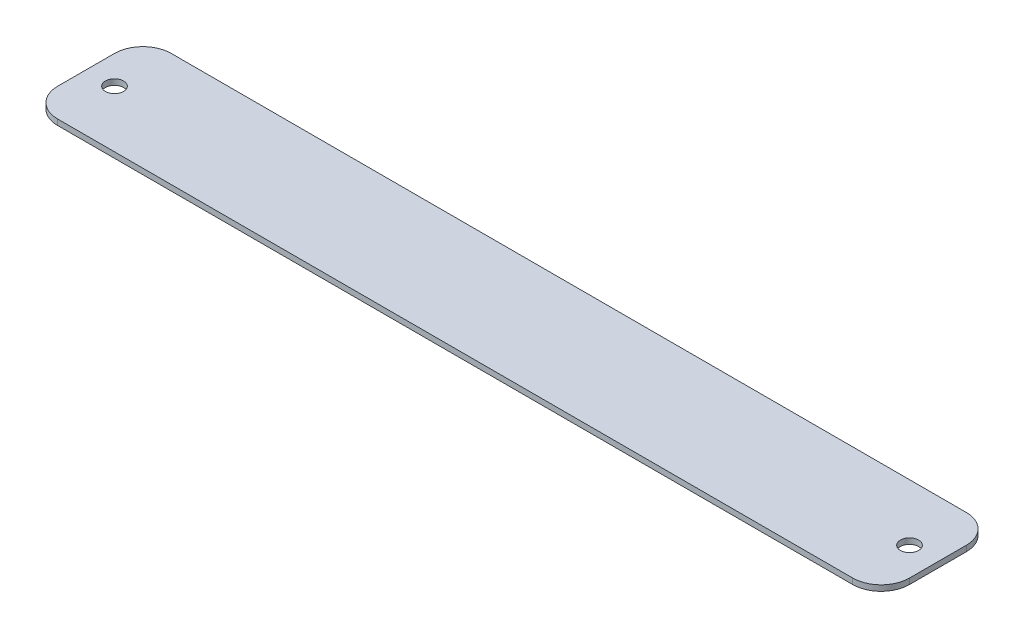
ISO-10303-21;
HEADER;
FILE_DESCRIPTION(('STEP AP214'),'2;1');
FILE_NAME('part.step','',(''),(''),'','','');
FILE_SCHEMA(('AUTOMOTIVE_DESIGN { 1 0 10303 214 1 1 1 1 }'));
ENDSEC;
DATA;
#1=APPLICATION_CONTEXT('core data for automotive mechanical design processes');
#2=APPLICATION_PROTOCOL_DEFINITION('international standard','automotive_design',2000,#1);
#3=PRODUCT_CONTEXT('',#1,'mechanical');
#4=PRODUCT('Part','Part','',(#3));
#5=PRODUCT_RELATED_PRODUCT_CATEGORY('part','',(#4));
#6=PRODUCT_DEFINITION_FORMATION('','',#4);
#7=PRODUCT_DEFINITION_CONTEXT('part definition',#1,'design');
#8=PRODUCT_DEFINITION('design','',#6,#7);
#9=PRODUCT_DEFINITION_SHAPE('','',#8);
#10=(LENGTH_UNIT() NAMED_UNIT(*) SI_UNIT(.MILLI.,.METRE.));
#11=(NAMED_UNIT(*) PLANE_ANGLE_UNIT() SI_UNIT($,.RADIAN.));
#12=(NAMED_UNIT(*) SI_UNIT($,.STERADIAN.) SOLID_ANGLE_UNIT());
#13=UNCERTAINTY_MEASURE_WITH_UNIT(LENGTH_MEASURE(1.E-05),#10,'distance_accuracy_value','');
#14=(GEOMETRIC_REPRESENTATION_CONTEXT(3) GLOBAL_UNCERTAINTY_ASSIGNED_CONTEXT((#13)) GLOBAL_UNIT_ASSIGNED_CONTEXT((#10,
#11,#12)) REPRESENTATION_CONTEXT('',''));
#15=CARTESIAN_POINT('',(0.,0.,0.));
#16=DIRECTION('',(0.,0.,1.));
#17=DIRECTION('',(1.,0.,0.));
#18=AXIS2_PLACEMENT_3D('',#15,#16,#17);
#19=CARTESIAN_POINT('',(0.,1.,0.));
#20=DIRECTION('',(0.,1.,0.));
#21=DIRECTION('',(0.,0.,1.));
#22=AXIS2_PLACEMENT_3D('',#19,#20,#21);
#23=PLANE('',#22);
#24=CARTESIAN_POINT('',(-70.,1.,0.));
#25=DIRECTION('',(0.,1.,0.));
#26=DIRECTION('',(0.,0.,1.));
#27=AXIS2_PLACEMENT_3D('',#24,#25,#26);
#28=CIRCLE('',#27,1.60000000000001);
#29=CARTESIAN_POINT('',(-70.,1.,1.60000000000001));
#30=VERTEX_POINT('',#29);
#31=EDGE_CURVE('E172',#30,#30,#28,.T.);
#32=ORIENTED_EDGE('',*,*,#31,.F.);
#33=EDGE_LOOP('',(#32));
#34=FACE_BOUND('',#33,.T.);
#35=DIRECTION('',(0.,0.,1.));
#36=VECTOR('',#35,1.);
#37=CARTESIAN_POINT('',(-75.,1.,-10.));
#38=LINE('',#37,#36);
#39=CARTESIAN_POINT('',(-75.,1.,-5.));
#40=VERTEX_POINT('',#39);
#41=CARTESIAN_POINT('',(-75.,1.,5.));
#42=VERTEX_POINT('',#41);
#43=EDGE_CURVE('E179',#40,#42,#38,.T.);
#44=ORIENTED_EDGE('',*,*,#43,.T.);
#45=CARTESIAN_POINT('',(-70.,1.,5.));
#46=DIRECTION('',(0.,1.,0.));
#47=DIRECTION('',(0.,0.,1.));
#48=AXIS2_PLACEMENT_3D('',#45,#46,#47);
#49=CIRCLE('',#48,5.);
#50=CARTESIAN_POINT('',(-70.,1.,10.));
#51=VERTEX_POINT('',#50);
#52=EDGE_CURVE('E156',#42,#51,#49,.T.);
#53=ORIENTED_EDGE('',*,*,#52,.T.);
#54=DIRECTION('',(1.,0.,0.));
#55=VECTOR('',#54,1.);
#56=CARTESIAN_POINT('',(-75.,1.,10.));
#57=LINE('',#56,#55);
#58=CARTESIAN_POINT('',(70.,1.,10.));
#59=VERTEX_POINT('',#58);
#60=EDGE_CURVE('E130',#51,#59,#57,.T.);
#61=ORIENTED_EDGE('',*,*,#60,.T.);
#62=CARTESIAN_POINT('',(70.,1.,5.));
#63=DIRECTION('',(0.,1.,0.));
#64=DIRECTION('',(0.,0.,1.));
#65=AXIS2_PLACEMENT_3D('',#62,#63,#64);
#66=CIRCLE('',#65,5.);
#67=CARTESIAN_POINT('',(75.,1.,5.));
#68=VERTEX_POINT('',#67);
#69=EDGE_CURVE('E151',#59,#68,#66,.T.);
#70=ORIENTED_EDGE('',*,*,#69,.T.);
#71=DIRECTION('',(0.,0.,-1.));
#72=VECTOR('',#71,1.);
#73=CARTESIAN_POINT('',(75.,1.,-10.));
#74=LINE('',#73,#72);
#75=CARTESIAN_POINT('',(75.,1.,-5.));
#76=VERTEX_POINT('',#75);
#77=EDGE_CURVE('E133',#68,#76,#74,.T.);
#78=ORIENTED_EDGE('',*,*,#77,.T.);
#79=CARTESIAN_POINT('',(70.,1.,-5.));
#80=DIRECTION('',(0.,1.,0.));
#81=DIRECTION('',(0.,0.,1.));
#82=AXIS2_PLACEMENT_3D('',#79,#80,#81);
#83=CIRCLE('',#82,5.);
#84=CARTESIAN_POINT('',(70.,1.,-10.));
#85=VERTEX_POINT('',#84);
#86=EDGE_CURVE('E64',#76,#85,#83,.T.);
#87=ORIENTED_EDGE('',*,*,#86,.T.);
#88=DIRECTION('',(-1.,0.,0.));
#89=VECTOR('',#88,1.);
#90=CARTESIAN_POINT('',(-75.,1.,-10.));
#91=LINE('',#90,#89);
#92=CARTESIAN_POINT('',(-70.,1.,-10.));
#93=VERTEX_POINT('',#92);
#94=EDGE_CURVE('E140',#85,#93,#91,.T.);
#95=ORIENTED_EDGE('',*,*,#94,.T.);
#96=CARTESIAN_POINT('',(-70.,1.,-5.));
#97=DIRECTION('',(0.,1.,0.));
#98=DIRECTION('',(0.,0.,1.));
#99=AXIS2_PLACEMENT_3D('',#96,#97,#98);
#100=CIRCLE('',#99,5.);
#101=EDGE_CURVE('E152',#93,#40,#100,.T.);
#102=ORIENTED_EDGE('',*,*,#101,.T.);
#103=EDGE_LOOP('',(#44,#53,#61,#70,#78,#87,#95,#102));
#104=FACE_BOUND('',#103,.T.);
#105=CARTESIAN_POINT('',(70.,1.,0.));
#106=DIRECTION('',(0.,1.,0.));
#107=DIRECTION('',(0.,0.,1.));
#108=AXIS2_PLACEMENT_3D('',#105,#106,#107);
#109=CIRCLE('',#108,1.60000000000001);
#110=CARTESIAN_POINT('',(70.,1.,1.59999999999999));
#111=VERTEX_POINT('',#110);
#112=EDGE_CURVE('E184',#111,#111,#109,.T.);
#113=ORIENTED_EDGE('',*,*,#112,.F.);
#114=EDGE_LOOP('',(#113));
#115=FACE_BOUND('',#114,.T.);
#116=ADVANCED_FACE('F41',(#34,#104,#115),#23,.T.);
#117=CARTESIAN_POINT('',(0.,0.,0.));
#118=DIRECTION('',(0.,1.,0.));
#119=DIRECTION('',(0.,0.,1.));
#120=AXIS2_PLACEMENT_3D('',#117,#118,#119);
#121=PLANE('',#120);
#122=DIRECTION('',(1.,0.,0.));
#123=VECTOR('',#122,1.);
#124=CARTESIAN_POINT('',(-75.,0.,10.));
#125=LINE('',#124,#123);
#126=CARTESIAN_POINT('',(-70.,0.,10.));
#127=VERTEX_POINT('',#126);
#128=CARTESIAN_POINT('',(70.,0.,10.));
#129=VERTEX_POINT('',#128);
#130=EDGE_CURVE('E124',#127,#129,#125,.T.);
#131=ORIENTED_EDGE('',*,*,#130,.F.);
#132=CARTESIAN_POINT('',(-70.,0.,5.));
#133=DIRECTION('',(0.,1.,0.));
#134=DIRECTION('',(0.,0.,1.));
#135=AXIS2_PLACEMENT_3D('',#132,#133,#134);
#136=CIRCLE('',#135,5.);
#137=CARTESIAN_POINT('',(-75.,0.,5.));
#138=VERTEX_POINT('',#137);
#139=EDGE_CURVE('E110',#127,#138,#136,.F.);
#140=ORIENTED_EDGE('',*,*,#139,.T.);
#141=DIRECTION('',(0.,0.,1.));
#142=VECTOR('',#141,1.);
#143=CARTESIAN_POINT('',(-75.,0.,-10.));
#144=LINE('',#143,#142);
#145=CARTESIAN_POINT('',(-75.,0.,-5.));
#146=VERTEX_POINT('',#145);
#147=EDGE_CURVE('E135',#146,#138,#144,.T.);
#148=ORIENTED_EDGE('',*,*,#147,.F.);
#149=CARTESIAN_POINT('',(-70.,0.,-5.));
#150=DIRECTION('',(0.,1.,0.));
#151=DIRECTION('',(0.,0.,1.));
#152=AXIS2_PLACEMENT_3D('',#149,#150,#151);
#153=CIRCLE('',#152,5.);
#154=CARTESIAN_POINT('',(-70.,0.,-10.));
#155=VERTEX_POINT('',#154);
#156=EDGE_CURVE('E119',#146,#155,#153,.F.);
#157=ORIENTED_EDGE('',*,*,#156,.T.);
#158=DIRECTION('',(-1.,0.,0.));
#159=VECTOR('',#158,1.);
#160=CARTESIAN_POINT('',(-75.,0.,-10.));
#161=LINE('',#160,#159);
#162=CARTESIAN_POINT('',(70.,0.,-10.));
#163=VERTEX_POINT('',#162);
#164=EDGE_CURVE('E139',#163,#155,#161,.T.);
#165=ORIENTED_EDGE('',*,*,#164,.F.);
#166=CARTESIAN_POINT('',(70.,0.,-5.));
#167=DIRECTION('',(0.,1.,0.));
#168=DIRECTION('',(0.,0.,1.));
#169=AXIS2_PLACEMENT_3D('',#166,#167,#168);
#170=CIRCLE('',#169,5.);
#171=CARTESIAN_POINT('',(75.,0.,-5.));
#172=VERTEX_POINT('',#171);
#173=EDGE_CURVE('E144',#163,#172,#170,.F.);
#174=ORIENTED_EDGE('',*,*,#173,.T.);
#175=DIRECTION('',(0.,0.,-1.));
#176=VECTOR('',#175,1.);
#177=CARTESIAN_POINT('',(75.,0.,-10.));
#178=LINE('',#177,#176);
#179=CARTESIAN_POINT('',(75.,0.,5.));
#180=VERTEX_POINT('',#179);
#181=EDGE_CURVE('E170',#180,#172,#178,.T.);
#182=ORIENTED_EDGE('',*,*,#181,.F.);
#183=CARTESIAN_POINT('',(70.,0.,5.));
#184=DIRECTION('',(0.,1.,0.));
#185=DIRECTION('',(0.,0.,1.));
#186=AXIS2_PLACEMENT_3D('',#183,#184,#185);
#187=CIRCLE('',#186,5.);
#188=EDGE_CURVE('E126',#180,#129,#187,.F.);
#189=ORIENTED_EDGE('',*,*,#188,.T.);
#190=EDGE_LOOP('',(#131,#140,#148,#157,#165,#174,#182,#189));
#191=FACE_BOUND('',#190,.T.);
#192=CARTESIAN_POINT('',(-70.,0.,0.));
#193=DIRECTION('',(0.,1.,0.));
#194=DIRECTION('',(0.,0.,1.));
#195=AXIS2_PLACEMENT_3D('',#192,#193,#194);
#196=CIRCLE('',#195,1.60000000000001);
#197=CARTESIAN_POINT('',(-70.,0.,1.60000000000001));
#198=VERTEX_POINT('',#197);
#199=EDGE_CURVE('E175',#198,#198,#196,.T.);
#200=ORIENTED_EDGE('',*,*,#199,.T.);
#201=EDGE_LOOP('',(#200));
#202=FACE_BOUND('',#201,.T.);
#203=CARTESIAN_POINT('',(70.,0.,0.));
#204=DIRECTION('',(0.,1.,0.));
#205=DIRECTION('',(0.,0.,1.));
#206=AXIS2_PLACEMENT_3D('',#203,#204,#205);
#207=CIRCLE('',#206,1.60000000000001);
#208=CARTESIAN_POINT('',(70.,0.,1.59999999999999));
#209=VERTEX_POINT('',#208);
#210=EDGE_CURVE('E186',#209,#209,#207,.T.);
#211=ORIENTED_EDGE('',*,*,#210,.T.);
#212=EDGE_LOOP('',(#211));
#213=FACE_BOUND('',#212,.T.);
#214=ADVANCED_FACE('F131',(#191,#202,#213),#121,.F.);
#215=CARTESIAN_POINT('',(75.,1.,-10.));
#216=DIRECTION('',(-1.,0.,0.));
#217=DIRECTION('',(0.,0.,1.));
#218=AXIS2_PLACEMENT_3D('',#215,#216,#217);
#219=PLANE('',#218);
#220=ORIENTED_EDGE('',*,*,#181,.T.);
#221=DIRECTION('',(0.,-1.,0.));
#222=VECTOR('',#221,1.);
#223=CARTESIAN_POINT('',(75.,1.,-5.));
#224=LINE('',#223,#222);
#225=EDGE_CURVE('E11',#172,#76,#224,.F.);
#226=ORIENTED_EDGE('',*,*,#225,.T.);
#227=ORIENTED_EDGE('',*,*,#77,.F.);
#228=DIRECTION('',(0.,-1.,0.));
#229=VECTOR('',#228,1.);
#230=CARTESIAN_POINT('',(75.,1.,5.));
#231=LINE('',#230,#229);
#232=EDGE_CURVE('E47',#68,#180,#231,.T.);
#233=ORIENTED_EDGE('',*,*,#232,.T.);
#234=EDGE_LOOP('',(#220,#226,#227,#233));
#235=FACE_BOUND('',#234,.T.);
#236=ADVANCED_FACE('F167',(#235),#219,.F.);
#237=CARTESIAN_POINT('',(-75.,1.,-10.));
#238=DIRECTION('',(0.,0.,1.));
#239=DIRECTION('',(1.,0.,0.));
#240=AXIS2_PLACEMENT_3D('',#237,#238,#239);
#241=PLANE('',#240);
#242=ORIENTED_EDGE('',*,*,#164,.T.);
#243=DIRECTION('',(0.,-1.,0.));
#244=VECTOR('',#243,1.);
#245=CARTESIAN_POINT('',(-70.,1.,-10.));
#246=LINE('',#245,#244);
#247=EDGE_CURVE('E57',#155,#93,#246,.F.);
#248=ORIENTED_EDGE('',*,*,#247,.T.);
#249=ORIENTED_EDGE('',*,*,#94,.F.);
#250=DIRECTION('',(0.,-1.,0.));
#251=VECTOR('',#250,1.);
#252=CARTESIAN_POINT('',(70.,1.,-10.));
#253=LINE('',#252,#251);
#254=EDGE_CURVE('E158',#85,#163,#253,.T.);
#255=ORIENTED_EDGE('',*,*,#254,.T.);
#256=EDGE_LOOP('',(#242,#248,#249,#255));
#257=FACE_BOUND('',#256,.T.);
#258=ADVANCED_FACE('F213',(#257),#241,.F.);
#259=CARTESIAN_POINT('',(-75.,1.,-10.));
#260=DIRECTION('',(1.,0.,0.));
#261=DIRECTION('',(0.,0.,-1.));
#262=AXIS2_PLACEMENT_3D('',#259,#260,#261);
#263=PLANE('',#262);
#264=ORIENTED_EDGE('',*,*,#147,.T.);
#265=DIRECTION('',(0.,-1.,0.));
#266=VECTOR('',#265,1.);
#267=CARTESIAN_POINT('',(-75.,1.,5.));
#268=LINE('',#267,#266);
#269=EDGE_CURVE('E115',#138,#42,#268,.F.);
#270=ORIENTED_EDGE('',*,*,#269,.T.);
#271=ORIENTED_EDGE('',*,*,#43,.F.);
#272=DIRECTION('',(0.,-1.,0.));
#273=VECTOR('',#272,1.);
#274=CARTESIAN_POINT('',(-75.,1.,-5.));
#275=LINE('',#274,#273);
#276=EDGE_CURVE('E117',#40,#146,#275,.T.);
#277=ORIENTED_EDGE('',*,*,#276,.T.);
#278=EDGE_LOOP('',(#264,#270,#271,#277));
#279=FACE_BOUND('',#278,.T.);
#280=ADVANCED_FACE('F209',(#279),#263,.F.);
#281=CARTESIAN_POINT('',(-75.,1.,10.));
#282=DIRECTION('',(0.,0.,-1.));
#283=DIRECTION('',(-1.,0.,0.));
#284=AXIS2_PLACEMENT_3D('',#281,#282,#283);
#285=PLANE('',#284);
#286=ORIENTED_EDGE('',*,*,#60,.F.);
#287=DIRECTION('',(0.,-1.,0.));
#288=VECTOR('',#287,1.);
#289=CARTESIAN_POINT('',(-70.,1.,10.));
#290=LINE('',#289,#288);
#291=EDGE_CURVE('E112',#51,#127,#290,.T.);
#292=ORIENTED_EDGE('',*,*,#291,.T.);
#293=ORIENTED_EDGE('',*,*,#130,.T.);
#294=DIRECTION('',(0.,-1.,0.));
#295=VECTOR('',#294,1.);
#296=CARTESIAN_POINT('',(70.,1.,10.));
#297=LINE('',#296,#295);
#298=EDGE_CURVE('E129',#129,#59,#297,.F.);
#299=ORIENTED_EDGE('',*,*,#298,.T.);
#300=EDGE_LOOP('',(#286,#292,#293,#299));
#301=FACE_BOUND('',#300,.T.);
#302=ADVANCED_FACE('F121',(#301),#285,.F.);
#303=CARTESIAN_POINT('',(-70.,1.,0.));
#304=DIRECTION('',(0.,-1.,0.));
#305=DIRECTION('',(0.,0.,-1.));
#306=AXIS2_PLACEMENT_3D('',#303,#304,#305);
#307=CYLINDRICAL_SURFACE('',#306,1.60000000000001);
#308=ORIENTED_EDGE('',*,*,#31,.T.);
#309=EDGE_LOOP('',(#308));
#310=FACE_BOUND('',#309,.T.);
#311=ORIENTED_EDGE('',*,*,#199,.F.);
#312=EDGE_LOOP('',(#311));
#313=FACE_BOUND('',#312,.T.);
#314=ADVANCED_FACE('F202',(#310,#313),#307,.F.);
#315=CARTESIAN_POINT('',(70.,1.,0.));
#316=DIRECTION('',(0.,-1.,0.));
#317=DIRECTION('',(0.,0.,-1.));
#318=AXIS2_PLACEMENT_3D('',#315,#316,#317);
#319=CYLINDRICAL_SURFACE('',#318,1.60000000000001);
#320=ORIENTED_EDGE('',*,*,#112,.T.);
#321=EDGE_LOOP('',(#320));
#322=FACE_BOUND('',#321,.T.);
#323=ORIENTED_EDGE('',*,*,#210,.F.);
#324=EDGE_LOOP('',(#323));
#325=FACE_BOUND('',#324,.T.);
#326=ADVANCED_FACE('F195',(#322,#325),#319,.F.);
#327=CARTESIAN_POINT('',(-70.,1.,5.));
#328=DIRECTION('',(0.,-1.,0.));
#329=DIRECTION('',(0.,0.,-1.));
#330=AXIS2_PLACEMENT_3D('',#327,#328,#329);
#331=CYLINDRICAL_SURFACE('',#330,5.);
#332=ORIENTED_EDGE('',*,*,#52,.F.);
#333=ORIENTED_EDGE('',*,*,#269,.F.);
#334=ORIENTED_EDGE('',*,*,#139,.F.);
#335=ORIENTED_EDGE('',*,*,#291,.F.);
#336=EDGE_LOOP('',(#332,#333,#334,#335));
#337=FACE_BOUND('',#336,.T.);
#338=ADVANCED_FACE('F109',(#337),#331,.T.);
#339=CARTESIAN_POINT('',(-70.,1.,-5.));
#340=DIRECTION('',(0.,-1.,0.));
#341=DIRECTION('',(0.,0.,-1.));
#342=AXIS2_PLACEMENT_3D('',#339,#340,#341);
#343=CYLINDRICAL_SURFACE('',#342,5.);
#344=ORIENTED_EDGE('',*,*,#101,.F.);
#345=ORIENTED_EDGE('',*,*,#247,.F.);
#346=ORIENTED_EDGE('',*,*,#156,.F.);
#347=ORIENTED_EDGE('',*,*,#276,.F.);
#348=EDGE_LOOP('',(#344,#345,#346,#347));
#349=FACE_BOUND('',#348,.T.);
#350=ADVANCED_FACE('F222',(#349),#343,.T.);
#351=CARTESIAN_POINT('',(70.,1.,-5.));
#352=DIRECTION('',(0.,-1.,0.));
#353=DIRECTION('',(0.,0.,-1.));
#354=AXIS2_PLACEMENT_3D('',#351,#352,#353);
#355=CYLINDRICAL_SURFACE('',#354,5.);
#356=ORIENTED_EDGE('',*,*,#86,.F.);
#357=ORIENTED_EDGE('',*,*,#225,.F.);
#358=ORIENTED_EDGE('',*,*,#173,.F.);
#359=ORIENTED_EDGE('',*,*,#254,.F.);
#360=EDGE_LOOP('',(#356,#357,#358,#359));
#361=FACE_BOUND('',#360,.T.);
#362=ADVANCED_FACE('F224',(#361),#355,.T.);
#363=CARTESIAN_POINT('',(70.,1.,5.));
#364=DIRECTION('',(0.,-1.,0.));
#365=DIRECTION('',(0.,0.,-1.));
#366=AXIS2_PLACEMENT_3D('',#363,#364,#365);
#367=CYLINDRICAL_SURFACE('',#366,5.);
#368=ORIENTED_EDGE('',*,*,#69,.F.);
#369=ORIENTED_EDGE('',*,*,#298,.F.);
#370=ORIENTED_EDGE('',*,*,#188,.F.);
#371=ORIENTED_EDGE('',*,*,#232,.F.);
#372=EDGE_LOOP('',(#368,#369,#370,#371));
#373=FACE_BOUND('',#372,.T.);
#374=ADVANCED_FACE('F43',(#373),#367,.T.);
#375=CLOSED_SHELL('',(#116,#214,#236,#258,#280,#302,#314,#326,#338,#350,#362,#374));
#376=MANIFOLD_SOLID_BREP('B2',#375);
#377=ADVANCED_BREP_SHAPE_REPRESENTATION('',(#18,#376),#14);
#378=SHAPE_DEFINITION_REPRESENTATION(#9,#377);
ENDSEC;
END-ISO-10303-21;
